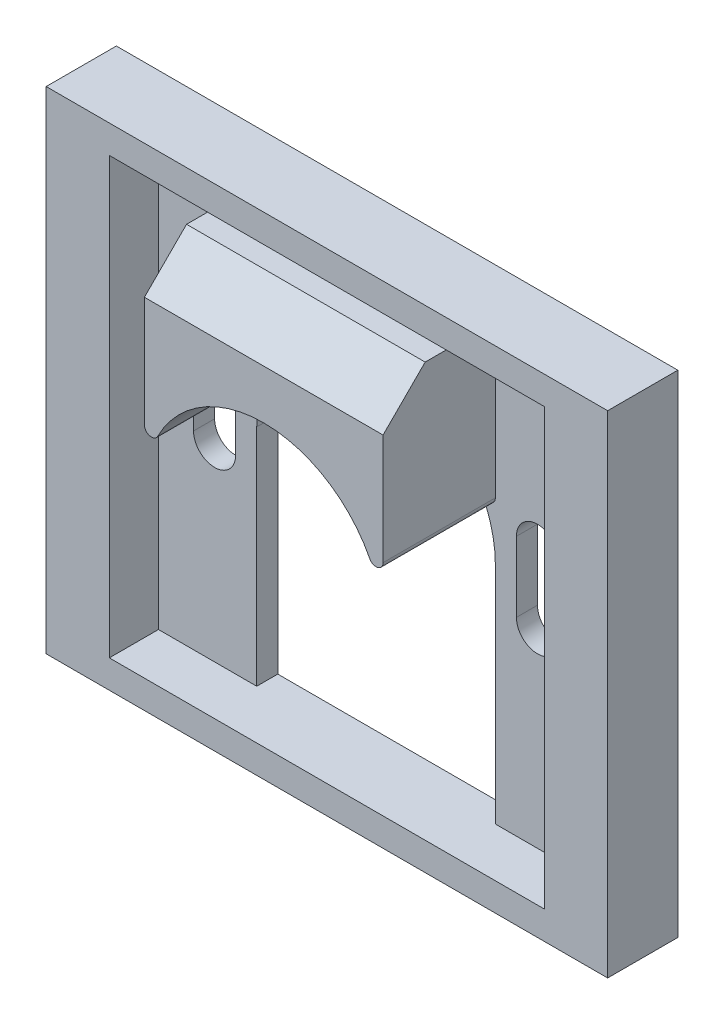
ISO-10303-21;
HEADER;
FILE_DESCRIPTION(('STEP AP214'),'2;1');
FILE_NAME('part.step','',(''),(''),'','','');
FILE_SCHEMA(('AUTOMOTIVE_DESIGN { 1 0 10303 214 1 1 1 1 }'));
ENDSEC;
DATA;
#1=APPLICATION_CONTEXT('core data for automotive mechanical design processes');
#2=APPLICATION_PROTOCOL_DEFINITION('international standard','automotive_design',2000,#1);
#3=PRODUCT_CONTEXT('',#1,'mechanical');
#4=PRODUCT('Part','Part','',(#3));
#5=PRODUCT_RELATED_PRODUCT_CATEGORY('part','',(#4));
#6=PRODUCT_DEFINITION_FORMATION('','',#4);
#7=PRODUCT_DEFINITION_CONTEXT('part definition',#1,'design');
#8=PRODUCT_DEFINITION('design','',#6,#7);
#9=PRODUCT_DEFINITION_SHAPE('','',#8);
#10=(LENGTH_UNIT() NAMED_UNIT(*) SI_UNIT(.MILLI.,.METRE.));
#11=(NAMED_UNIT(*) PLANE_ANGLE_UNIT() SI_UNIT($,.RADIAN.));
#12=(NAMED_UNIT(*) SI_UNIT($,.STERADIAN.) SOLID_ANGLE_UNIT());
#13=UNCERTAINTY_MEASURE_WITH_UNIT(LENGTH_MEASURE(1.E-05),#10,'distance_accuracy_value','');
#14=(GEOMETRIC_REPRESENTATION_CONTEXT(3) GLOBAL_UNCERTAINTY_ASSIGNED_CONTEXT((#13)) GLOBAL_UNIT_ASSIGNED_CONTEXT((#10,
#11,#12)) REPRESENTATION_CONTEXT('',''));
#15=CARTESIAN_POINT('',(0.,0.,0.));
#16=DIRECTION('',(0.,0.,1.));
#17=DIRECTION('',(1.,0.,0.));
#18=AXIS2_PLACEMENT_3D('',#15,#16,#17);
#19=CARTESIAN_POINT('',(15.5,-15.,1.5));
#20=DIRECTION('',(1.,0.,0.));
#21=DIRECTION('',(0.,1.,0.));
#22=AXIS2_PLACEMENT_3D('',#19,#20,#21);
#23=PLANE('',#22);
#24=DIRECTION('',(0.,1.,0.));
#25=VECTOR('',#24,1.);
#26=CARTESIAN_POINT('',(15.5,-15.,1.5));
#27=LINE('',#26,#25);
#28=CARTESIAN_POINT('',(15.5,-18.,1.5));
#29=VERTEX_POINT('',#28);
#30=CARTESIAN_POINT('',(15.5,13.,1.5));
#31=VERTEX_POINT('',#30);
#32=EDGE_CURVE('E67',#29,#31,#27,.T.);
#33=ORIENTED_EDGE('',*,*,#32,.F.);
#34=DIRECTION('',(0.,0.,-1.));
#35=VECTOR('',#34,1.);
#36=CARTESIAN_POINT('',(15.5,-18.,5.));
#37=LINE('',#36,#35);
#38=CARTESIAN_POINT('',(15.5,-18.,5.));
#39=VERTEX_POINT('',#38);
#40=EDGE_CURVE('E268',#39,#29,#37,.T.);
#41=ORIENTED_EDGE('',*,*,#40,.F.);
#42=DIRECTION('',(0.,1.,0.));
#43=VECTOR('',#42,1.);
#44=CARTESIAN_POINT('',(15.5,-15.,5.));
#45=LINE('',#44,#43);
#46=CARTESIAN_POINT('',(15.5,13.,5.));
#47=VERTEX_POINT('',#46);
#48=EDGE_CURVE('E388',#39,#47,#45,.T.);
#49=ORIENTED_EDGE('',*,*,#48,.T.);
#50=DIRECTION('',(0.,0.,1.));
#51=VECTOR('',#50,1.);
#52=CARTESIAN_POINT('',(15.5,13.,1.5));
#53=LINE('',#52,#51);
#54=EDGE_CURVE('E386',#31,#47,#53,.T.);
#55=ORIENTED_EDGE('',*,*,#54,.F.);
#56=EDGE_LOOP('',(#33,#41,#49,#55));
#57=FACE_BOUND('',#56,.T.);
#58=ADVANCED_FACE('F43',(#57),#23,.F.);
#59=CARTESIAN_POINT('',(-15.5,-15.,1.5));
#60=DIRECTION('',(-1.,0.,0.));
#61=DIRECTION('',(0.,0.,1.));
#62=AXIS2_PLACEMENT_3D('',#59,#60,#61);
#63=PLANE('',#62);
#64=DIRECTION('',(0.,0.,-1.));
#65=VECTOR('',#64,1.);
#66=CARTESIAN_POINT('',(-15.5,-18.,5.));
#67=LINE('',#66,#65);
#68=CARTESIAN_POINT('',(-15.5,-18.,5.));
#69=VERTEX_POINT('',#68);
#70=CARTESIAN_POINT('',(-15.5,-18.,1.5));
#71=VERTEX_POINT('',#70);
#72=EDGE_CURVE('E272',#69,#71,#67,.T.);
#73=ORIENTED_EDGE('',*,*,#72,.T.);
#74=DIRECTION('',(0.,-1.,0.));
#75=VECTOR('',#74,1.);
#76=CARTESIAN_POINT('',(-15.5,-15.,1.5));
#77=LINE('',#76,#75);
#78=CARTESIAN_POINT('',(-15.5,13.,1.5));
#79=VERTEX_POINT('',#78);
#80=EDGE_CURVE('E378',#79,#71,#77,.T.);
#81=ORIENTED_EDGE('',*,*,#80,.F.);
#82=DIRECTION('',(0.,0.,1.));
#83=VECTOR('',#82,1.);
#84=CARTESIAN_POINT('',(-15.5,13.,1.5));
#85=LINE('',#84,#83);
#86=CARTESIAN_POINT('',(-15.5,13.,5.));
#87=VERTEX_POINT('',#86);
#88=EDGE_CURVE('E394',#79,#87,#85,.T.);
#89=ORIENTED_EDGE('',*,*,#88,.T.);
#90=DIRECTION('',(0.,-1.,0.));
#91=VECTOR('',#90,1.);
#92=CARTESIAN_POINT('',(-15.5,-15.,5.));
#93=LINE('',#92,#91);
#94=EDGE_CURVE('E375',#87,#69,#93,.T.);
#95=ORIENTED_EDGE('',*,*,#94,.T.);
#96=EDGE_LOOP('',(#73,#81,#89,#95));
#97=FACE_BOUND('',#96,.T.);
#98=ADVANCED_FACE('F505',(#97),#63,.F.);
#99=CARTESIAN_POINT('',(-15.5,13.,1.5));
#100=DIRECTION('',(0.,1.,0.));
#101=DIRECTION('',(0.,0.,1.));
#102=AXIS2_PLACEMENT_3D('',#99,#100,#101);
#103=PLANE('',#102);
#104=DIRECTION('',(0.,0.,-1.));
#105=VECTOR('',#104,1.);
#106=CARTESIAN_POINT('',(8.5,13.,9.5));
#107=LINE('',#106,#105);
#108=CARTESIAN_POINT('',(8.5,13.,5.));
#109=VERTEX_POINT('',#108);
#110=CARTESIAN_POINT('',(8.5,13.,1.5));
#111=VERTEX_POINT('',#110);
#112=EDGE_CURVE('E298',#109,#111,#107,.T.);
#113=ORIENTED_EDGE('',*,*,#112,.T.);
#114=DIRECTION('',(-1.,0.,0.));
#115=VECTOR('',#114,1.);
#116=CARTESIAN_POINT('',(-15.5,13.,1.5));
#117=LINE('',#116,#115);
#118=EDGE_CURVE('E383',#31,#111,#117,.T.);
#119=ORIENTED_EDGE('',*,*,#118,.F.);
#120=ORIENTED_EDGE('',*,*,#54,.T.);
#121=DIRECTION('',(-1.,0.,0.));
#122=VECTOR('',#121,1.);
#123=CARTESIAN_POINT('',(-15.5,13.,5.));
#124=LINE('',#123,#122);
#125=EDGE_CURVE('E380',#47,#109,#124,.T.);
#126=ORIENTED_EDGE('',*,*,#125,.T.);
#127=EDGE_LOOP('',(#113,#119,#120,#126));
#128=FACE_BOUND('',#127,.T.);
#129=ADVANCED_FACE('F483',(#128),#103,.F.);
#130=DIRECTION('',(0.,0.,-1.));
#131=VECTOR('',#130,1.);
#132=CARTESIAN_POINT('',(-8.5,13.,9.5));
#133=LINE('',#132,#131);
#134=CARTESIAN_POINT('',(-8.5,13.,5.));
#135=VERTEX_POINT('',#134);
#136=CARTESIAN_POINT('',(-8.5,13.,1.5));
#137=VERTEX_POINT('',#136);
#138=EDGE_CURVE('E292',#135,#137,#133,.T.);
#139=ORIENTED_EDGE('',*,*,#138,.F.);
#140=EDGE_CURVE('E391',#135,#87,#124,.T.);
#141=ORIENTED_EDGE('',*,*,#140,.T.);
#142=ORIENTED_EDGE('',*,*,#88,.F.);
#143=EDGE_CURVE('E382',#137,#79,#117,.T.);
#144=ORIENTED_EDGE('',*,*,#143,.F.);
#145=EDGE_LOOP('',(#139,#141,#142,#144));
#146=FACE_BOUND('',#145,.T.);
#147=ADVANCED_FACE('F493',(#146),#103,.F.);
#148=CARTESIAN_POINT('',(0.,0.,1.5));
#149=DIRECTION('',(0.,0.,-1.));
#150=DIRECTION('',(-1.,0.,0.));
#151=AXIS2_PLACEMENT_3D('',#148,#149,#150);
#152=PLANE('',#151);
#153=DIRECTION('',(0.,1.,0.));
#154=VECTOR('',#153,1.);
#155=CARTESIAN_POINT('',(13.,-4.5,1.5));
#156=LINE('',#155,#154);
#157=CARTESIAN_POINT('',(13.,-4.5,1.5));
#158=VERTEX_POINT('',#157);
#159=CARTESIAN_POINT('',(13.,0.500000000000004,1.5));
#160=VERTEX_POINT('',#159);
#161=EDGE_CURVE('E323',#158,#160,#156,.T.);
#162=ORIENTED_EDGE('',*,*,#161,.F.);
#163=CARTESIAN_POINT('',(11.5,-4.5,1.5));
#164=DIRECTION('',(0.,0.,1.));
#165=DIRECTION('',(1.,0.,0.));
#166=AXIS2_PLACEMENT_3D('',#163,#164,#165);
#167=CIRCLE('',#166,1.5);
#168=CARTESIAN_POINT('',(10.,-4.5,1.5));
#169=VERTEX_POINT('',#168);
#170=EDGE_CURVE('E326',#169,#158,#167,.T.);
#171=ORIENTED_EDGE('',*,*,#170,.F.);
#172=DIRECTION('',(0.,-1.,0.));
#173=VECTOR('',#172,1.);
#174=CARTESIAN_POINT('',(10.,-4.5,1.5));
#175=LINE('',#174,#173);
#176=CARTESIAN_POINT('',(10.,0.500000000000004,1.5));
#177=VERTEX_POINT('',#176);
#178=EDGE_CURVE('E316',#177,#169,#175,.T.);
#179=ORIENTED_EDGE('',*,*,#178,.F.);
#180=CARTESIAN_POINT('',(11.5,0.500000000000004,1.5));
#181=DIRECTION('',(0.,0.,1.));
#182=DIRECTION('',(-1.,0.,0.));
#183=AXIS2_PLACEMENT_3D('',#180,#181,#182);
#184=CIRCLE('',#183,1.5);
#185=EDGE_CURVE('E319',#160,#177,#184,.T.);
#186=ORIENTED_EDGE('',*,*,#185,.F.);
#187=EDGE_LOOP('',(#162,#171,#179,#186));
#188=FACE_BOUND('',#187,.T.);
#189=DIRECTION('',(0.,1.,0.));
#190=VECTOR('',#189,1.);
#191=CARTESIAN_POINT('',(8.5,13.,1.5));
#192=LINE('',#191,#190);
#193=CARTESIAN_POINT('',(8.5,2.12310562561767,1.5));
#194=VERTEX_POINT('',#193);
#195=EDGE_CURVE('E275',#194,#111,#192,.T.);
#196=ORIENTED_EDGE('',*,*,#195,.F.);
#197=CARTESIAN_POINT('',(8.,2.12310562561767,1.5));
#198=DIRECTION('',(0.,0.,-1.));
#199=DIRECTION('',(-1.,0.,0.));
#200=AXIS2_PLACEMENT_3D('',#197,#198,#199);
#201=CIRCLE('',#200,0.5);
#202=CARTESIAN_POINT('',(7.55555555555556,1.89404420197224,1.5));
#203=VERTEX_POINT('',#202);
#204=EDGE_CURVE('E440',#194,#203,#201,.T.);
#205=ORIENTED_EDGE('',*,*,#204,.T.);
#206=CARTESIAN_POINT('',(0.,-2.,1.5));
#207=DIRECTION('',(0.,0.,-1.));
#208=DIRECTION('',(-1.,0.,0.));
#209=AXIS2_PLACEMENT_3D('',#206,#207,#208);
#210=CIRCLE('',#209,8.5);
#211=CARTESIAN_POINT('',(8.5,-2.,1.5));
#212=VERTEX_POINT('',#211);
#213=EDGE_CURVE('E420',#212,#203,#210,.F.);
#214=ORIENTED_EDGE('',*,*,#213,.F.);
#215=DIRECTION('',(0.,1.,0.));
#216=VECTOR('',#215,1.);
#217=CARTESIAN_POINT('',(8.5,-2.,1.5));
#218=LINE('',#217,#216);
#219=CARTESIAN_POINT('',(8.5,-18.,1.5));
#220=VERTEX_POINT('',#219);
#221=EDGE_CURVE('E59',#220,#212,#218,.T.);
#222=ORIENTED_EDGE('',*,*,#221,.F.);
#223=DIRECTION('',(-1.,0.,0.));
#224=VECTOR('',#223,1.);
#225=CARTESIAN_POINT('',(15.5,-18.,1.5));
#226=LINE('',#225,#224);
#227=EDGE_CURVE('E255',#29,#220,#226,.T.);
#228=ORIENTED_EDGE('',*,*,#227,.F.);
#229=ORIENTED_EDGE('',*,*,#32,.T.);
#230=ORIENTED_EDGE('',*,*,#118,.T.);
#231=EDGE_LOOP('',(#196,#205,#214,#222,#228,#229,#230));
#232=FACE_BOUND('',#231,.T.);
#233=ADVANCED_FACE('F480',(#188,#232),#152,.F.);
#234=DIRECTION('',(0.,1.,0.));
#235=VECTOR('',#234,1.);
#236=CARTESIAN_POINT('',(-10.,-4.5,1.5));
#237=LINE('',#236,#235);
#238=CARTESIAN_POINT('',(-10.,-4.5,1.5));
#239=VERTEX_POINT('',#238);
#240=CARTESIAN_POINT('',(-10.,0.500000000000004,1.5));
#241=VERTEX_POINT('',#240);
#242=EDGE_CURVE('E355',#239,#241,#237,.T.);
#243=ORIENTED_EDGE('',*,*,#242,.F.);
#244=CARTESIAN_POINT('',(-11.5,-4.5,1.5));
#245=DIRECTION('',(0.,0.,1.));
#246=DIRECTION('',(-1.,0.,0.));
#247=AXIS2_PLACEMENT_3D('',#244,#245,#246);
#248=CIRCLE('',#247,1.5);
#249=CARTESIAN_POINT('',(-13.,-4.5,1.5));
#250=VERTEX_POINT('',#249);
#251=EDGE_CURVE('E315',#250,#239,#248,.T.);
#252=ORIENTED_EDGE('',*,*,#251,.F.);
#253=DIRECTION('',(0.,-1.,0.));
#254=VECTOR('',#253,1.);
#255=CARTESIAN_POINT('',(-13.,-4.5,1.5));
#256=LINE('',#255,#254);
#257=CARTESIAN_POINT('',(-13.,0.500000000000004,1.5));
#258=VERTEX_POINT('',#257);
#259=EDGE_CURVE('E348',#258,#250,#256,.T.);
#260=ORIENTED_EDGE('',*,*,#259,.F.);
#261=CARTESIAN_POINT('',(-11.5,0.500000000000004,1.5));
#262=DIRECTION('',(0.,0.,1.));
#263=DIRECTION('',(1.,0.,0.));
#264=AXIS2_PLACEMENT_3D('',#261,#262,#263);
#265=CIRCLE('',#264,1.5);
#266=EDGE_CURVE('E351',#241,#258,#265,.T.);
#267=ORIENTED_EDGE('',*,*,#266,.F.);
#268=EDGE_LOOP('',(#243,#252,#260,#267));
#269=FACE_BOUND('',#268,.T.);
#270=DIRECTION('',(0.,-1.,0.));
#271=VECTOR('',#270,1.);
#272=CARTESIAN_POINT('',(-8.5,-2.00000000000006,1.5));
#273=LINE('',#272,#271);
#274=CARTESIAN_POINT('',(-8.5,2.12310562561767,1.5));
#275=VERTEX_POINT('',#274);
#276=EDGE_CURVE('E287',#137,#275,#273,.T.);
#277=ORIENTED_EDGE('',*,*,#276,.F.);
#278=ORIENTED_EDGE('',*,*,#143,.T.);
#279=ORIENTED_EDGE('',*,*,#80,.T.);
#280=DIRECTION('',(-1.,0.,0.));
#281=VECTOR('',#280,1.);
#282=CARTESIAN_POINT('',(-8.5,-18.,1.5));
#283=LINE('',#282,#281);
#284=CARTESIAN_POINT('',(-8.5,-18.,1.5));
#285=VERTEX_POINT('',#284);
#286=EDGE_CURVE('E257',#285,#71,#283,.T.);
#287=ORIENTED_EDGE('',*,*,#286,.F.);
#288=DIRECTION('',(0.,-1.,0.));
#289=VECTOR('',#288,1.);
#290=CARTESIAN_POINT('',(-8.5,-15.,1.5));
#291=LINE('',#290,#289);
#292=CARTESIAN_POINT('',(-8.5,-2.,1.5));
#293=VERTEX_POINT('',#292);
#294=EDGE_CURVE('E328',#293,#285,#291,.T.);
#295=ORIENTED_EDGE('',*,*,#294,.F.);
#296=CARTESIAN_POINT('',(0.,-2.,1.5));
#297=DIRECTION('',(0.,0.,-1.));
#298=DIRECTION('',(-1.,0.,0.));
#299=AXIS2_PLACEMENT_3D('',#296,#297,#298);
#300=CIRCLE('',#299,8.5);
#301=CARTESIAN_POINT('',(-7.55555555555556,1.89404420197224,1.5));
#302=VERTEX_POINT('',#301);
#303=EDGE_CURVE('E423',#302,#293,#300,.F.);
#304=ORIENTED_EDGE('',*,*,#303,.F.);
#305=CARTESIAN_POINT('',(-8.,2.12310562561767,1.5));
#306=DIRECTION('',(0.,0.,-1.));
#307=DIRECTION('',(-1.,0.,0.));
#308=AXIS2_PLACEMENT_3D('',#305,#306,#307);
#309=CIRCLE('',#308,0.5);
#310=EDGE_CURVE('E438',#302,#275,#309,.T.);
#311=ORIENTED_EDGE('',*,*,#310,.T.);
#312=EDGE_LOOP('',(#277,#278,#279,#287,#295,#304,#311));
#313=FACE_BOUND('',#312,.T.);
#314=ADVANCED_FACE('F496',(#269,#313),#152,.F.);
#315=CARTESIAN_POINT('',(20.,-15.,5.));
#316=DIRECTION('',(-1.,0.,0.));
#317=DIRECTION('',(0.,0.,1.));
#318=AXIS2_PLACEMENT_3D('',#315,#316,#317);
#319=PLANE('',#318);
#320=DIRECTION('',(0.,1.,0.));
#321=VECTOR('',#320,1.);
#322=CARTESIAN_POINT('',(20.,-15.,0.));
#323=LINE('',#322,#321);
#324=CARTESIAN_POINT('',(20.,-20.,0.));
#325=VERTEX_POINT('',#324);
#326=CARTESIAN_POINT('',(20.,15.,0.));
#327=VERTEX_POINT('',#326);
#328=EDGE_CURVE('E397',#325,#327,#323,.T.);
#329=ORIENTED_EDGE('',*,*,#328,.T.);
#330=DIRECTION('',(0.,0.,-1.));
#331=VECTOR('',#330,1.);
#332=CARTESIAN_POINT('',(20.,15.,5.));
#333=LINE('',#332,#331);
#334=CARTESIAN_POINT('',(20.,15.,5.));
#335=VERTEX_POINT('',#334);
#336=EDGE_CURVE('E415',#335,#327,#333,.T.);
#337=ORIENTED_EDGE('',*,*,#336,.F.);
#338=DIRECTION('',(0.,1.,0.));
#339=VECTOR('',#338,1.);
#340=CARTESIAN_POINT('',(20.,-15.,5.));
#341=LINE('',#340,#339);
#342=CARTESIAN_POINT('',(20.,-20.,5.));
#343=VERTEX_POINT('',#342);
#344=EDGE_CURVE('E399',#343,#335,#341,.T.);
#345=ORIENTED_EDGE('',*,*,#344,.F.);
#346=DIRECTION('',(0.,0.,-1.));
#347=VECTOR('',#346,1.);
#348=CARTESIAN_POINT('',(20.,-20.,5.));
#349=LINE('',#348,#347);
#350=EDGE_CURVE('E279',#343,#325,#349,.T.);
#351=ORIENTED_EDGE('',*,*,#350,.T.);
#352=EDGE_LOOP('',(#329,#337,#345,#351));
#353=FACE_BOUND('',#352,.T.);
#354=ADVANCED_FACE('F527',(#353),#319,.F.);
#355=CARTESIAN_POINT('',(-20.,15.,5.));
#356=DIRECTION('',(0.,-1.,0.));
#357=DIRECTION('',(0.,0.,-1.));
#358=AXIS2_PLACEMENT_3D('',#355,#356,#357);
#359=PLANE('',#358);
#360=DIRECTION('',(-1.,0.,0.));
#361=VECTOR('',#360,1.);
#362=CARTESIAN_POINT('',(-20.,15.,0.));
#363=LINE('',#362,#361);
#364=CARTESIAN_POINT('',(-20.,15.,0.));
#365=VERTEX_POINT('',#364);
#366=EDGE_CURVE('E410',#327,#365,#363,.T.);
#367=ORIENTED_EDGE('',*,*,#366,.T.);
#368=DIRECTION('',(0.,0.,-1.));
#369=VECTOR('',#368,1.);
#370=CARTESIAN_POINT('',(-20.,15.,5.));
#371=LINE('',#370,#369);
#372=CARTESIAN_POINT('',(-20.,15.,5.));
#373=VERTEX_POINT('',#372);
#374=EDGE_CURVE('E407',#373,#365,#371,.T.);
#375=ORIENTED_EDGE('',*,*,#374,.F.);
#376=DIRECTION('',(-1.,0.,0.));
#377=VECTOR('',#376,1.);
#378=CARTESIAN_POINT('',(-20.,15.,5.));
#379=LINE('',#378,#377);
#380=EDGE_CURVE('E402',#335,#373,#379,.T.);
#381=ORIENTED_EDGE('',*,*,#380,.F.);
#382=ORIENTED_EDGE('',*,*,#336,.T.);
#383=EDGE_LOOP('',(#367,#375,#381,#382));
#384=FACE_BOUND('',#383,.T.);
#385=ADVANCED_FACE('F523',(#384),#359,.F.);
#386=CARTESIAN_POINT('',(-20.,-15.,5.));
#387=DIRECTION('',(1.,0.,0.));
#388=DIRECTION('',(0.,0.,-1.));
#389=AXIS2_PLACEMENT_3D('',#386,#387,#388);
#390=PLANE('',#389);
#391=DIRECTION('',(0.,-1.,0.));
#392=VECTOR('',#391,1.);
#393=CARTESIAN_POINT('',(-20.,-15.,0.));
#394=LINE('',#393,#392);
#395=CARTESIAN_POINT('',(-20.,-20.,0.));
#396=VERTEX_POINT('',#395);
#397=EDGE_CURVE('E403',#365,#396,#394,.T.);
#398=ORIENTED_EDGE('',*,*,#397,.T.);
#399=DIRECTION('',(0.,0.,-1.));
#400=VECTOR('',#399,1.);
#401=CARTESIAN_POINT('',(-20.,-20.,5.));
#402=LINE('',#401,#400);
#403=CARTESIAN_POINT('',(-20.,-20.,5.));
#404=VERTEX_POINT('',#403);
#405=EDGE_CURVE('E276',#404,#396,#402,.T.);
#406=ORIENTED_EDGE('',*,*,#405,.F.);
#407=DIRECTION('',(0.,-1.,0.));
#408=VECTOR('',#407,1.);
#409=CARTESIAN_POINT('',(-20.,-15.,5.));
#410=LINE('',#409,#408);
#411=EDGE_CURVE('E405',#373,#404,#410,.T.);
#412=ORIENTED_EDGE('',*,*,#411,.F.);
#413=ORIENTED_EDGE('',*,*,#374,.T.);
#414=EDGE_LOOP('',(#398,#406,#412,#413));
#415=FACE_BOUND('',#414,.T.);
#416=ADVANCED_FACE('F518',(#415),#390,.F.);
#417=CARTESIAN_POINT('',(0.,0.,5.));
#418=DIRECTION('',(0.,0.,-1.));
#419=DIRECTION('',(-1.,0.,0.));
#420=AXIS2_PLACEMENT_3D('',#417,#418,#419);
#421=PLANE('',#420);
#422=DIRECTION('',(-1.,0.,0.));
#423=VECTOR('',#422,1.);
#424=CARTESIAN_POINT('',(0.,-18.,5.));
#425=LINE('',#424,#423);
#426=EDGE_CURVE('E263',#39,#69,#425,.T.);
#427=ORIENTED_EDGE('',*,*,#426,.T.);
#428=ORIENTED_EDGE('',*,*,#94,.F.);
#429=ORIENTED_EDGE('',*,*,#140,.F.);
#430=DIRECTION('',(-1.,0.,0.));
#431=VECTOR('',#430,1.);
#432=CARTESIAN_POINT('',(0.,13.,5.));
#433=LINE('',#432,#431);
#434=EDGE_CURVE('E301',#109,#135,#433,.T.);
#435=ORIENTED_EDGE('',*,*,#434,.F.);
#436=ORIENTED_EDGE('',*,*,#125,.F.);
#437=ORIENTED_EDGE('',*,*,#48,.F.);
#438=EDGE_LOOP('',(#427,#428,#429,#435,#436,#437));
#439=FACE_BOUND('',#438,.T.);
#440=ORIENTED_EDGE('',*,*,#411,.T.);
#441=DIRECTION('',(-1.,0.,0.));
#442=VECTOR('',#441,1.);
#443=CARTESIAN_POINT('',(0.,-20.,5.));
#444=LINE('',#443,#442);
#445=EDGE_CURVE('E266',#343,#404,#444,.T.);
#446=ORIENTED_EDGE('',*,*,#445,.F.);
#447=ORIENTED_EDGE('',*,*,#344,.T.);
#448=ORIENTED_EDGE('',*,*,#380,.T.);
#449=EDGE_LOOP('',(#440,#446,#447,#448));
#450=FACE_BOUND('',#449,.T.);
#451=ADVANCED_FACE('F486',(#439,#450),#421,.F.);
#452=CARTESIAN_POINT('',(0.,0.,0.));
#453=DIRECTION('',(0.,0.,-1.));
#454=DIRECTION('',(-1.,0.,0.));
#455=AXIS2_PLACEMENT_3D('',#452,#453,#454);
#456=PLANE('',#455);
#457=DIRECTION('',(0.,-1.,0.));
#458=VECTOR('',#457,1.);
#459=CARTESIAN_POINT('',(-8.5,-15.,0.));
#460=LINE('',#459,#458);
#461=CARTESIAN_POINT('',(-8.5,-2.,0.));
#462=VERTEX_POINT('',#461);
#463=CARTESIAN_POINT('',(-8.5,-18.,0.));
#464=VERTEX_POINT('',#463);
#465=EDGE_CURVE('E241',#462,#464,#460,.T.);
#466=ORIENTED_EDGE('',*,*,#465,.T.);
#467=DIRECTION('',(-1.,0.,0.));
#468=VECTOR('',#467,1.);
#469=CARTESIAN_POINT('',(0.,-18.,0.));
#470=LINE('',#469,#468);
#471=CARTESIAN_POINT('',(8.5,-18.,0.));
#472=VERTEX_POINT('',#471);
#473=EDGE_CURVE('E244',#472,#464,#470,.T.);
#474=ORIENTED_EDGE('',*,*,#473,.F.);
#475=DIRECTION('',(0.,1.,0.));
#476=VECTOR('',#475,1.);
#477=CARTESIAN_POINT('',(8.5,-2.,0.));
#478=LINE('',#477,#476);
#479=CARTESIAN_POINT('',(8.5,-2.,0.));
#480=VERTEX_POINT('',#479);
#481=EDGE_CURVE('E230',#472,#480,#478,.T.);
#482=ORIENTED_EDGE('',*,*,#481,.T.);
#483=CARTESIAN_POINT('',(0.,-2.,0.));
#484=DIRECTION('',(0.,0.,1.));
#485=DIRECTION('',(1.,0.,0.));
#486=AXIS2_PLACEMENT_3D('',#483,#484,#485);
#487=CIRCLE('',#486,8.5);
#488=EDGE_CURVE('E369',#480,#462,#487,.T.);
#489=ORIENTED_EDGE('',*,*,#488,.T.);
#490=EDGE_LOOP('',(#466,#474,#482,#489));
#491=FACE_BOUND('',#490,.T.);
#492=CARTESIAN_POINT('',(-11.5,-4.5,0.));
#493=DIRECTION('',(0.,0.,1.));
#494=DIRECTION('',(-1.,0.,0.));
#495=AXIS2_PLACEMENT_3D('',#492,#493,#494);
#496=CIRCLE('',#495,1.5);
#497=CARTESIAN_POINT('',(-13.,-4.5,0.));
#498=VERTEX_POINT('',#497);
#499=CARTESIAN_POINT('',(-10.,-4.5,0.));
#500=VERTEX_POINT('',#499);
#501=EDGE_CURVE('E352',#498,#500,#496,.T.);
#502=ORIENTED_EDGE('',*,*,#501,.T.);
#503=DIRECTION('',(0.,1.,0.));
#504=VECTOR('',#503,1.);
#505=CARTESIAN_POINT('',(-10.,-4.5,0.));
#506=LINE('',#505,#504);
#507=CARTESIAN_POINT('',(-10.,0.500000000000004,0.));
#508=VERTEX_POINT('',#507);
#509=EDGE_CURVE('E364',#500,#508,#506,.T.);
#510=ORIENTED_EDGE('',*,*,#509,.T.);
#511=CARTESIAN_POINT('',(-11.5,0.500000000000004,0.));
#512=DIRECTION('',(0.,0.,1.));
#513=DIRECTION('',(1.,0.,0.));
#514=AXIS2_PLACEMENT_3D('',#511,#512,#513);
#515=CIRCLE('',#514,1.5);
#516=CARTESIAN_POINT('',(-13.,0.500000000000004,0.));
#517=VERTEX_POINT('',#516);
#518=EDGE_CURVE('E361',#508,#517,#515,.T.);
#519=ORIENTED_EDGE('',*,*,#518,.T.);
#520=DIRECTION('',(0.,-1.,0.));
#521=VECTOR('',#520,1.);
#522=CARTESIAN_POINT('',(-13.,-4.5,0.));
#523=LINE('',#522,#521);
#524=EDGE_CURVE('E342',#517,#498,#523,.T.);
#525=ORIENTED_EDGE('',*,*,#524,.T.);
#526=EDGE_LOOP('',(#502,#510,#519,#525));
#527=FACE_BOUND('',#526,.T.);
#528=CARTESIAN_POINT('',(11.5,-4.5,0.));
#529=DIRECTION('',(0.,0.,1.));
#530=DIRECTION('',(1.,0.,0.));
#531=AXIS2_PLACEMENT_3D('',#528,#529,#530);
#532=CIRCLE('',#531,1.5);
#533=CARTESIAN_POINT('',(10.,-4.5,0.));
#534=VERTEX_POINT('',#533);
#535=CARTESIAN_POINT('',(13.,-4.5,0.));
#536=VERTEX_POINT('',#535);
#537=EDGE_CURVE('E320',#534,#536,#532,.T.);
#538=ORIENTED_EDGE('',*,*,#537,.T.);
#539=DIRECTION('',(0.,1.,0.));
#540=VECTOR('',#539,1.);
#541=CARTESIAN_POINT('',(13.,-4.5,0.));
#542=LINE('',#541,#540);
#543=CARTESIAN_POINT('',(13.,0.500000000000004,0.));
#544=VERTEX_POINT('',#543);
#545=EDGE_CURVE('E334',#536,#544,#542,.T.);
#546=ORIENTED_EDGE('',*,*,#545,.T.);
#547=CARTESIAN_POINT('',(11.5,0.500000000000004,0.));
#548=DIRECTION('',(0.,0.,1.));
#549=DIRECTION('',(-1.,0.,0.));
#550=AXIS2_PLACEMENT_3D('',#547,#548,#549);
#551=CIRCLE('',#550,1.5);
#552=CARTESIAN_POINT('',(10.,0.500000000000004,0.));
#553=VERTEX_POINT('',#552);
#554=EDGE_CURVE('E331',#544,#553,#551,.T.);
#555=ORIENTED_EDGE('',*,*,#554,.T.);
#556=DIRECTION('',(0.,-1.,0.));
#557=VECTOR('',#556,1.);
#558=CARTESIAN_POINT('',(10.,-4.5,0.));
#559=LINE('',#558,#557);
#560=EDGE_CURVE('E308',#553,#534,#559,.T.);
#561=ORIENTED_EDGE('',*,*,#560,.T.);
#562=EDGE_LOOP('',(#538,#546,#555,#561));
#563=FACE_BOUND('',#562,.T.);
#564=DIRECTION('',(-1.,0.,0.));
#565=VECTOR('',#564,1.);
#566=CARTESIAN_POINT('',(0.,-20.,0.));
#567=LINE('',#566,#565);
#568=EDGE_CURVE('E251',#325,#396,#567,.T.);
#569=ORIENTED_EDGE('',*,*,#568,.T.);
#570=ORIENTED_EDGE('',*,*,#397,.F.);
#571=ORIENTED_EDGE('',*,*,#366,.F.);
#572=ORIENTED_EDGE('',*,*,#328,.F.);
#573=EDGE_LOOP('',(#569,#570,#571,#572));
#574=FACE_BOUND('',#573,.T.);
#575=ADVANCED_FACE('F245',(#491,#527,#563,#574),#456,.T.);
#576=CARTESIAN_POINT('',(0.,-2.,0.));
#577=DIRECTION('',(0.,0.,1.));
#578=DIRECTION('',(1.,0.,0.));
#579=AXIS2_PLACEMENT_3D('',#576,#577,#578);
#580=CYLINDRICAL_SURFACE('',#579,8.5);
#581=CARTESIAN_POINT('',(0.,-2.00000000000003,9.5));
#582=DIRECTION('',(0.,0.,-1.));
#583=DIRECTION('',(-1.,0.,0.));
#584=AXIS2_PLACEMENT_3D('',#581,#582,#583);
#585=CIRCLE('',#584,8.5);
#586=CARTESIAN_POINT('',(-7.55555555555554,1.89404420197223,9.5));
#587=VERTEX_POINT('',#586);
#588=CARTESIAN_POINT('',(7.55555555555554,1.89404420197223,9.5));
#589=VERTEX_POINT('',#588);
#590=EDGE_CURVE('E283',#587,#589,#585,.T.);
#591=ORIENTED_EDGE('',*,*,#590,.F.);
#592=DIRECTION('',(0.,0.,1.));
#593=VECTOR('',#592,1.);
#594=CARTESIAN_POINT('',(-7.55555555555556,1.89404420197224,0.));
#595=LINE('',#594,#593);
#596=EDGE_CURVE('E425',#587,#302,#595,.F.);
#597=ORIENTED_EDGE('',*,*,#596,.T.);
#598=ORIENTED_EDGE('',*,*,#303,.T.);
#599=DIRECTION('',(0.,0.,1.));
#600=VECTOR('',#599,1.);
#601=CARTESIAN_POINT('',(-8.5,-2.,0.));
#602=LINE('',#601,#600);
#603=EDGE_CURVE('E240',#462,#293,#602,.T.);
#604=ORIENTED_EDGE('',*,*,#603,.F.);
#605=ORIENTED_EDGE('',*,*,#488,.F.);
#606=DIRECTION('',(0.,0.,1.));
#607=VECTOR('',#606,1.);
#608=CARTESIAN_POINT('',(8.5,-2.,0.));
#609=LINE('',#608,#607);
#610=EDGE_CURVE('E236',#480,#212,#609,.T.);
#611=ORIENTED_EDGE('',*,*,#610,.T.);
#612=ORIENTED_EDGE('',*,*,#213,.T.);
#613=DIRECTION('',(0.,0.,1.));
#614=VECTOR('',#613,1.);
#615=CARTESIAN_POINT('',(7.55555555555556,1.89404420197224,0.));
#616=LINE('',#615,#614);
#617=EDGE_CURVE('E418',#203,#589,#616,.T.);
#618=ORIENTED_EDGE('',*,*,#617,.T.);
#619=EDGE_LOOP('',(#591,#597,#598,#604,#605,#611,#612,#618));
#620=FACE_BOUND('',#619,.T.);
#621=ADVANCED_FACE('F474',(#620),#580,.F.);
#622=CARTESIAN_POINT('',(8.5,-2.,0.));
#623=DIRECTION('',(1.,0.,0.));
#624=DIRECTION('',(0.,0.,-1.));
#625=AXIS2_PLACEMENT_3D('',#622,#623,#624);
#626=PLANE('',#625);
#627=ORIENTED_EDGE('',*,*,#221,.T.);
#628=ORIENTED_EDGE('',*,*,#610,.F.);
#629=ORIENTED_EDGE('',*,*,#481,.F.);
#630=DIRECTION('',(0.,0.,-1.));
#631=VECTOR('',#630,1.);
#632=CARTESIAN_POINT('',(8.5,-18.,1.5));
#633=LINE('',#632,#631);
#634=EDGE_CURVE('E234',#220,#472,#633,.T.);
#635=ORIENTED_EDGE('',*,*,#634,.F.);
#636=EDGE_LOOP('',(#627,#628,#629,#635));
#637=FACE_BOUND('',#636,.T.);
#638=ADVANCED_FACE('F232',(#637),#626,.F.);
#639=CARTESIAN_POINT('',(-8.5,-15.,0.));
#640=DIRECTION('',(-1.,0.,0.));
#641=DIRECTION('',(0.,0.,1.));
#642=AXIS2_PLACEMENT_3D('',#639,#640,#641);
#643=PLANE('',#642);
#644=ORIENTED_EDGE('',*,*,#294,.T.);
#645=DIRECTION('',(0.,0.,-1.));
#646=VECTOR('',#645,1.);
#647=CARTESIAN_POINT('',(-8.5,-18.,1.5));
#648=LINE('',#647,#646);
#649=EDGE_CURVE('E252',#285,#464,#648,.T.);
#650=ORIENTED_EDGE('',*,*,#649,.T.);
#651=ORIENTED_EDGE('',*,*,#465,.F.);
#652=ORIENTED_EDGE('',*,*,#603,.T.);
#653=EDGE_LOOP('',(#644,#650,#651,#652));
#654=FACE_BOUND('',#653,.T.);
#655=ADVANCED_FACE('F501',(#654),#643,.F.);
#656=CARTESIAN_POINT('',(11.5,-4.5,0.));
#657=DIRECTION('',(0.,0.,1.));
#658=DIRECTION('',(1.,0.,0.));
#659=AXIS2_PLACEMENT_3D('',#656,#657,#658);
#660=CYLINDRICAL_SURFACE('',#659,1.5);
#661=ORIENTED_EDGE('',*,*,#170,.T.);
#662=DIRECTION('',(0.,0.,1.));
#663=VECTOR('',#662,1.);
#664=CARTESIAN_POINT('',(13.,-4.5,0.));
#665=LINE('',#664,#663);
#666=EDGE_CURVE('E305',#536,#158,#665,.T.);
#667=ORIENTED_EDGE('',*,*,#666,.F.);
#668=ORIENTED_EDGE('',*,*,#537,.F.);
#669=DIRECTION('',(0.,0.,1.));
#670=VECTOR('',#669,1.);
#671=CARTESIAN_POINT('',(10.,-4.5,0.));
#672=LINE('',#671,#670);
#673=EDGE_CURVE('E313',#534,#169,#672,.T.);
#674=ORIENTED_EDGE('',*,*,#673,.T.);
#675=EDGE_LOOP('',(#661,#667,#668,#674));
#676=FACE_BOUND('',#675,.T.);
#677=ADVANCED_FACE('F557',(#676),#660,.F.);
#678=CARTESIAN_POINT('',(10.,-4.5,0.));
#679=DIRECTION('',(-1.,0.,0.));
#680=DIRECTION('',(0.,0.,1.));
#681=AXIS2_PLACEMENT_3D('',#678,#679,#680);
#682=PLANE('',#681);
#683=ORIENTED_EDGE('',*,*,#178,.T.);
#684=ORIENTED_EDGE('',*,*,#673,.F.);
#685=ORIENTED_EDGE('',*,*,#560,.F.);
#686=DIRECTION('',(0.,0.,1.));
#687=VECTOR('',#686,1.);
#688=CARTESIAN_POINT('',(10.,0.500000000000004,0.));
#689=LINE('',#688,#687);
#690=EDGE_CURVE('E311',#553,#177,#689,.T.);
#691=ORIENTED_EDGE('',*,*,#690,.T.);
#692=EDGE_LOOP('',(#683,#684,#685,#691));
#693=FACE_BOUND('',#692,.T.);
#694=ADVANCED_FACE('F560',(#693),#682,.F.);
#695=CARTESIAN_POINT('',(11.5,0.500000000000004,0.));
#696=DIRECTION('',(0.,0.,1.));
#697=DIRECTION('',(1.,0.,0.));
#698=AXIS2_PLACEMENT_3D('',#695,#696,#697);
#699=CYLINDRICAL_SURFACE('',#698,1.5);
#700=ORIENTED_EDGE('',*,*,#185,.T.);
#701=ORIENTED_EDGE('',*,*,#690,.F.);
#702=ORIENTED_EDGE('',*,*,#554,.F.);
#703=DIRECTION('',(0.,0.,1.));
#704=VECTOR('',#703,1.);
#705=CARTESIAN_POINT('',(13.,0.500000000000004,0.));
#706=LINE('',#705,#704);
#707=EDGE_CURVE('E309',#544,#160,#706,.T.);
#708=ORIENTED_EDGE('',*,*,#707,.T.);
#709=EDGE_LOOP('',(#700,#701,#702,#708));
#710=FACE_BOUND('',#709,.T.);
#711=ADVANCED_FACE('F566',(#710),#699,.F.);
#712=CARTESIAN_POINT('',(13.,-4.5,0.));
#713=DIRECTION('',(1.,0.,0.));
#714=DIRECTION('',(0.,0.,-1.));
#715=AXIS2_PLACEMENT_3D('',#712,#713,#714);
#716=PLANE('',#715);
#717=ORIENTED_EDGE('',*,*,#161,.T.);
#718=ORIENTED_EDGE('',*,*,#707,.F.);
#719=ORIENTED_EDGE('',*,*,#545,.F.);
#720=ORIENTED_EDGE('',*,*,#666,.T.);
#721=EDGE_LOOP('',(#717,#718,#719,#720));
#722=FACE_BOUND('',#721,.T.);
#723=ADVANCED_FACE('F562',(#722),#716,.F.);
#724=CARTESIAN_POINT('',(-11.5,-4.5,0.));
#725=DIRECTION('',(0.,0.,1.));
#726=DIRECTION('',(1.,0.,0.));
#727=AXIS2_PLACEMENT_3D('',#724,#725,#726);
#728=CYLINDRICAL_SURFACE('',#727,1.5);
#729=ORIENTED_EDGE('',*,*,#251,.T.);
#730=DIRECTION('',(0.,0.,1.));
#731=VECTOR('',#730,1.);
#732=CARTESIAN_POINT('',(-10.,-4.5,0.));
#733=LINE('',#732,#731);
#734=EDGE_CURVE('E339',#500,#239,#733,.T.);
#735=ORIENTED_EDGE('',*,*,#734,.F.);
#736=ORIENTED_EDGE('',*,*,#501,.F.);
#737=DIRECTION('',(0.,0.,1.));
#738=VECTOR('',#737,1.);
#739=CARTESIAN_POINT('',(-13.,-4.5,0.));
#740=LINE('',#739,#738);
#741=EDGE_CURVE('E304',#498,#250,#740,.T.);
#742=ORIENTED_EDGE('',*,*,#741,.T.);
#743=EDGE_LOOP('',(#729,#735,#736,#742));
#744=FACE_BOUND('',#743,.T.);
#745=ADVANCED_FACE('F565',(#744),#728,.F.);
#746=CARTESIAN_POINT('',(-13.,-4.5,0.));
#747=DIRECTION('',(-1.,0.,0.));
#748=DIRECTION('',(0.,0.,1.));
#749=AXIS2_PLACEMENT_3D('',#746,#747,#748);
#750=PLANE('',#749);
#751=ORIENTED_EDGE('',*,*,#259,.T.);
#752=ORIENTED_EDGE('',*,*,#741,.F.);
#753=ORIENTED_EDGE('',*,*,#524,.F.);
#754=DIRECTION('',(0.,0.,1.));
#755=VECTOR('',#754,1.);
#756=CARTESIAN_POINT('',(-13.,0.500000000000004,0.));
#757=LINE('',#756,#755);
#758=EDGE_CURVE('E345',#517,#258,#757,.T.);
#759=ORIENTED_EDGE('',*,*,#758,.T.);
#760=EDGE_LOOP('',(#751,#752,#753,#759));
#761=FACE_BOUND('',#760,.T.);
#762=ADVANCED_FACE('F576',(#761),#750,.F.);
#763=CARTESIAN_POINT('',(-11.5,0.500000000000004,0.));
#764=DIRECTION('',(0.,0.,1.));
#765=DIRECTION('',(1.,0.,0.));
#766=AXIS2_PLACEMENT_3D('',#763,#764,#765);
#767=CYLINDRICAL_SURFACE('',#766,1.5);
#768=ORIENTED_EDGE('',*,*,#266,.T.);
#769=ORIENTED_EDGE('',*,*,#758,.F.);
#770=ORIENTED_EDGE('',*,*,#518,.F.);
#771=DIRECTION('',(0.,0.,1.));
#772=VECTOR('',#771,1.);
#773=CARTESIAN_POINT('',(-10.,0.500000000000004,0.));
#774=LINE('',#773,#772);
#775=EDGE_CURVE('E343',#508,#241,#774,.T.);
#776=ORIENTED_EDGE('',*,*,#775,.T.);
#777=EDGE_LOOP('',(#768,#769,#770,#776));
#778=FACE_BOUND('',#777,.T.);
#779=ADVANCED_FACE('F580',(#778),#767,.F.);
#780=CARTESIAN_POINT('',(-10.,-4.5,0.));
#781=DIRECTION('',(1.,0.,0.));
#782=DIRECTION('',(0.,0.,-1.));
#783=AXIS2_PLACEMENT_3D('',#780,#781,#782);
#784=PLANE('',#783);
#785=ORIENTED_EDGE('',*,*,#242,.T.);
#786=ORIENTED_EDGE('',*,*,#775,.F.);
#787=ORIENTED_EDGE('',*,*,#509,.F.);
#788=ORIENTED_EDGE('',*,*,#734,.T.);
#789=EDGE_LOOP('',(#785,#786,#787,#788));
#790=FACE_BOUND('',#789,.T.);
#791=ADVANCED_FACE('F554',(#790),#784,.F.);
#792=CARTESIAN_POINT('',(-8.5,13.,9.5));
#793=DIRECTION('',(0.,-1.,0.));
#794=DIRECTION('',(0.,0.,-1.));
#795=AXIS2_PLACEMENT_3D('',#792,#793,#794);
#796=PLANE('',#795);
#797=CARTESIAN_POINT('',(-8.5,13.,6.49999999999999));
#798=VERTEX_POINT('',#797);
#799=EDGE_CURVE('E296',#798,#135,#133,.T.);
#800=ORIENTED_EDGE('',*,*,#799,.F.);
#801=DIRECTION('',(1.,0.,0.));
#802=VECTOR('',#801,1.);
#803=CARTESIAN_POINT('',(-8.5,13.,6.49999999999999));
#804=LINE('',#803,#802);
#805=CARTESIAN_POINT('',(8.5,13.,6.49999999999999));
#806=VERTEX_POINT('',#805);
#807=EDGE_CURVE('E52',#798,#806,#804,.T.);
#808=ORIENTED_EDGE('',*,*,#807,.T.);
#809=EDGE_CURVE('E299',#806,#109,#107,.T.);
#810=ORIENTED_EDGE('',*,*,#809,.T.);
#811=ORIENTED_EDGE('',*,*,#434,.T.);
#812=EDGE_LOOP('',(#800,#808,#810,#811));
#813=FACE_BOUND('',#812,.T.);
#814=ADVANCED_FACE('F450',(#813),#796,.F.);
#815=CARTESIAN_POINT('',(8.5,13.,9.5));
#816=DIRECTION('',(-1.,0.,0.));
#817=DIRECTION('',(0.,0.,1.));
#818=AXIS2_PLACEMENT_3D('',#815,#816,#817);
#819=PLANE('',#818);
#820=ORIENTED_EDGE('',*,*,#809,.F.);
#821=DIRECTION('',(0.,0.707106781186546,-0.707106781186549));
#822=VECTOR('',#821,1.);
#823=CARTESIAN_POINT('',(8.5,10.,9.5));
#824=LINE('',#823,#822);
#825=CARTESIAN_POINT('',(8.5,10.,9.5));
#826=VERTEX_POINT('',#825);
#827=EDGE_CURVE('E11',#806,#826,#824,.F.);
#828=ORIENTED_EDGE('',*,*,#827,.T.);
#829=DIRECTION('',(0.,1.,0.));
#830=VECTOR('',#829,1.);
#831=CARTESIAN_POINT('',(8.5,13.,9.5));
#832=LINE('',#831,#830);
#833=CARTESIAN_POINT('',(8.5,2.12310562561767,9.5));
#834=VERTEX_POINT('',#833);
#835=EDGE_CURVE('E286',#834,#826,#832,.T.);
#836=ORIENTED_EDGE('',*,*,#835,.F.);
#837=DIRECTION('',(0.,0.,1.));
#838=VECTOR('',#837,1.);
#839=CARTESIAN_POINT('',(8.5,2.12310562561767,9.5));
#840=LINE('',#839,#838);
#841=EDGE_CURVE('E435',#834,#194,#840,.F.);
#842=ORIENTED_EDGE('',*,*,#841,.T.);
#843=ORIENTED_EDGE('',*,*,#195,.T.);
#844=ORIENTED_EDGE('',*,*,#112,.F.);
#845=EDGE_LOOP('',(#820,#828,#836,#842,#843,#844));
#846=FACE_BOUND('',#845,.T.);
#847=ADVANCED_FACE('F455',(#846),#819,.F.);
#848=CARTESIAN_POINT('',(-8.5,-2.00000000000006,9.5));
#849=DIRECTION('',(1.,0.,0.));
#850=DIRECTION('',(0.,0.,-1.));
#851=AXIS2_PLACEMENT_3D('',#848,#849,#850);
#852=PLANE('',#851);
#853=DIRECTION('',(0.,-1.,0.));
#854=VECTOR('',#853,1.);
#855=CARTESIAN_POINT('',(-8.5,-2.00000000000006,9.5));
#856=LINE('',#855,#854);
#857=CARTESIAN_POINT('',(-8.5,10.,9.5));
#858=VERTEX_POINT('',#857);
#859=CARTESIAN_POINT('',(-8.5,2.12310562561767,9.5));
#860=VERTEX_POINT('',#859);
#861=EDGE_CURVE('E290',#858,#860,#856,.T.);
#862=ORIENTED_EDGE('',*,*,#861,.F.);
#863=DIRECTION('',(0.,-0.707106781186546,0.707106781186549));
#864=VECTOR('',#863,1.);
#865=CARTESIAN_POINT('',(-8.5,10.,9.5));
#866=LINE('',#865,#864);
#867=EDGE_CURVE('E445',#858,#798,#866,.F.);
#868=ORIENTED_EDGE('',*,*,#867,.T.);
#869=ORIENTED_EDGE('',*,*,#799,.T.);
#870=ORIENTED_EDGE('',*,*,#138,.T.);
#871=ORIENTED_EDGE('',*,*,#276,.T.);
#872=DIRECTION('',(0.,0.,1.));
#873=VECTOR('',#872,1.);
#874=CARTESIAN_POINT('',(-8.5,2.12310562561767,9.5));
#875=LINE('',#874,#873);
#876=EDGE_CURVE('E428',#275,#860,#875,.T.);
#877=ORIENTED_EDGE('',*,*,#876,.T.);
#878=EDGE_LOOP('',(#862,#868,#869,#870,#871,#877));
#879=FACE_BOUND('',#878,.T.);
#880=ADVANCED_FACE('F464',(#879),#852,.F.);
#881=CARTESIAN_POINT('',(0.,-2.00000000000003,9.5));
#882=DIRECTION('',(0.,0.,-1.));
#883=DIRECTION('',(-1.,0.,0.));
#884=AXIS2_PLACEMENT_3D('',#881,#882,#883);
#885=PLANE('',#884);
#886=ORIENTED_EDGE('',*,*,#835,.T.);
#887=DIRECTION('',(-1.,0.,0.));
#888=VECTOR('',#887,1.);
#889=CARTESIAN_POINT('',(0.,10.,9.5));
#890=LINE('',#889,#888);
#891=EDGE_CURVE('E442',#826,#858,#890,.T.);
#892=ORIENTED_EDGE('',*,*,#891,.T.);
#893=ORIENTED_EDGE('',*,*,#861,.T.);
#894=CARTESIAN_POINT('',(-8.,2.12310562561767,9.5));
#895=DIRECTION('',(0.,0.,-1.));
#896=DIRECTION('',(-1.,0.,0.));
#897=AXIS2_PLACEMENT_3D('',#894,#895,#896);
#898=CIRCLE('',#897,0.5);
#899=EDGE_CURVE('E433',#860,#587,#898,.F.);
#900=ORIENTED_EDGE('',*,*,#899,.T.);
#901=ORIENTED_EDGE('',*,*,#590,.T.);
#902=CARTESIAN_POINT('',(8.,2.12310562561767,9.5));
#903=DIRECTION('',(0.,0.,-1.));
#904=DIRECTION('',(-1.,0.,0.));
#905=AXIS2_PLACEMENT_3D('',#902,#903,#904);
#906=CIRCLE('',#905,0.5);
#907=EDGE_CURVE('E431',#589,#834,#906,.F.);
#908=ORIENTED_EDGE('',*,*,#907,.T.);
#909=EDGE_LOOP('',(#886,#892,#893,#900,#901,#908));
#910=FACE_BOUND('',#909,.T.);
#911=ADVANCED_FACE('F462',(#910),#885,.F.);
#912=CARTESIAN_POINT('',(-8.,2.12310562561767,0.));
#913=DIRECTION('',(0.,0.,1.));
#914=DIRECTION('',(1.,0.,0.));
#915=AXIS2_PLACEMENT_3D('',#912,#913,#914);
#916=CYLINDRICAL_SURFACE('',#915,0.5);
#917=ORIENTED_EDGE('',*,*,#899,.F.);
#918=ORIENTED_EDGE('',*,*,#876,.F.);
#919=ORIENTED_EDGE('',*,*,#310,.F.);
#920=ORIENTED_EDGE('',*,*,#596,.F.);
#921=EDGE_LOOP('',(#917,#918,#919,#920));
#922=FACE_BOUND('',#921,.T.);
#923=ADVANCED_FACE('F470',(#922),#916,.T.);
#924=CARTESIAN_POINT('',(8.,2.12310562561767,0.));
#925=DIRECTION('',(0.,0.,1.));
#926=DIRECTION('',(1.,0.,0.));
#927=AXIS2_PLACEMENT_3D('',#924,#925,#926);
#928=CYLINDRICAL_SURFACE('',#927,0.5);
#929=ORIENTED_EDGE('',*,*,#907,.F.);
#930=ORIENTED_EDGE('',*,*,#617,.F.);
#931=ORIENTED_EDGE('',*,*,#204,.F.);
#932=ORIENTED_EDGE('',*,*,#841,.F.);
#933=EDGE_LOOP('',(#929,#930,#931,#932));
#934=FACE_BOUND('',#933,.T.);
#935=ADVANCED_FACE('F477',(#934),#928,.T.);
#936=CARTESIAN_POINT('',(0.,10.,9.5));
#937=DIRECTION('',(0.,-0.707106781186549,-0.707106781186546));
#938=DIRECTION('',(-1.,0.,0.));
#939=AXIS2_PLACEMENT_3D('',#936,#937,#938);
#940=PLANE('',#939);
#941=ORIENTED_EDGE('',*,*,#827,.F.);
#942=ORIENTED_EDGE('',*,*,#807,.F.);
#943=ORIENTED_EDGE('',*,*,#867,.F.);
#944=ORIENTED_EDGE('',*,*,#891,.F.);
#945=EDGE_LOOP('',(#941,#942,#943,#944));
#946=FACE_BOUND('',#945,.T.);
#947=ADVANCED_FACE('F46',(#946),#940,.F.);
#948=CARTESIAN_POINT('',(0.,-18.,5.));
#949=DIRECTION('',(0.,-1.,0.));
#950=DIRECTION('',(0.,0.,-1.));
#951=AXIS2_PLACEMENT_3D('',#948,#949,#950);
#952=PLANE('',#951);
#953=ORIENTED_EDGE('',*,*,#227,.T.);
#954=ORIENTED_EDGE('',*,*,#634,.T.);
#955=ORIENTED_EDGE('',*,*,#473,.T.);
#956=ORIENTED_EDGE('',*,*,#649,.F.);
#957=ORIENTED_EDGE('',*,*,#286,.T.);
#958=ORIENTED_EDGE('',*,*,#72,.F.);
#959=ORIENTED_EDGE('',*,*,#426,.F.);
#960=ORIENTED_EDGE('',*,*,#40,.T.);
#961=EDGE_LOOP('',(#953,#954,#955,#956,#957,#958,#959,#960));
#962=FACE_BOUND('',#961,.T.);
#963=ADVANCED_FACE('F254',(#962),#952,.F.);
#964=CARTESIAN_POINT('',(0.,-20.,5.));
#965=DIRECTION('',(0.,-1.,0.));
#966=DIRECTION('',(0.,0.,-1.));
#967=AXIS2_PLACEMENT_3D('',#964,#965,#966);
#968=PLANE('',#967);
#969=ORIENTED_EDGE('',*,*,#568,.F.);
#970=ORIENTED_EDGE('',*,*,#350,.F.);
#971=ORIENTED_EDGE('',*,*,#445,.T.);
#972=ORIENTED_EDGE('',*,*,#405,.T.);
#973=EDGE_LOOP('',(#969,#970,#971,#972));
#974=FACE_BOUND('',#973,.T.);
#975=ADVANCED_FACE('F540',(#974),#968,.T.);
#976=CLOSED_SHELL('',(#58,#98,#129,#147,#233,#314,#354,#385,#416,#451,#575,#621,#638,#655,#677,
#694,#711,#723,#745,#762,#779,#791,#814,#847,#880,#911,#923,#935,#947,#963,#975));
#977=MANIFOLD_SOLID_BREP('B2',#976);
#978=ADVANCED_BREP_SHAPE_REPRESENTATION('',(#18,#977),#14);
#979=SHAPE_DEFINITION_REPRESENTATION(#9,#978);
ENDSEC;
END-ISO-10303-21;
